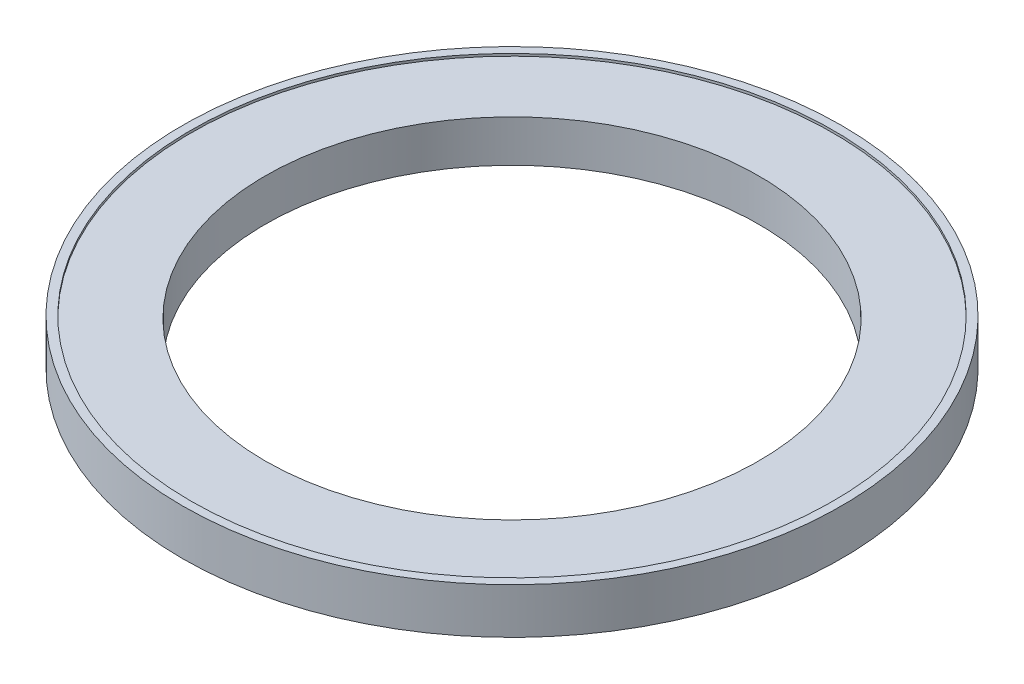
ISO-10303-21;
HEADER;
FILE_DESCRIPTION(('STEP AP214'),'2;1');
FILE_NAME('part.step','',(''),(''),'','','');
FILE_SCHEMA(('AUTOMOTIVE_DESIGN { 1 0 10303 214 1 1 1 1 }'));
ENDSEC;
DATA;
#1=APPLICATION_CONTEXT('core data for automotive mechanical design processes');
#2=APPLICATION_PROTOCOL_DEFINITION('international standard','automotive_design',2000,#1);
#3=PRODUCT_CONTEXT('',#1,'mechanical');
#4=PRODUCT('Part','Part','',(#3));
#5=PRODUCT_RELATED_PRODUCT_CATEGORY('part','',(#4));
#6=PRODUCT_DEFINITION_FORMATION('','',#4);
#7=PRODUCT_DEFINITION_CONTEXT('part definition',#1,'design');
#8=PRODUCT_DEFINITION('design','',#6,#7);
#9=PRODUCT_DEFINITION_SHAPE('','',#8);
#10=(LENGTH_UNIT() NAMED_UNIT(*) SI_UNIT(.MILLI.,.METRE.));
#11=(NAMED_UNIT(*) PLANE_ANGLE_UNIT() SI_UNIT($,.RADIAN.));
#12=(NAMED_UNIT(*) SI_UNIT($,.STERADIAN.) SOLID_ANGLE_UNIT());
#13=UNCERTAINTY_MEASURE_WITH_UNIT(LENGTH_MEASURE(1.E-05),#10,'distance_accuracy_value','');
#14=(GEOMETRIC_REPRESENTATION_CONTEXT(3) GLOBAL_UNCERTAINTY_ASSIGNED_CONTEXT((#13)) GLOBAL_UNIT_ASSIGNED_CONTEXT((#10,
#11,#12)) REPRESENTATION_CONTEXT('',''));
#15=CARTESIAN_POINT('',(0.,0.,0.));
#16=DIRECTION('',(0.,0.,1.));
#17=DIRECTION('',(1.,0.,0.));
#18=AXIS2_PLACEMENT_3D('',#15,#16,#17);
#19=CARTESIAN_POINT('',(0.,-3.81040868112797,0.));
#20=DIRECTION('',(0.,1.,0.));
#21=DIRECTION('',(0.,0.,1.));
#22=AXIS2_PLACEMENT_3D('',#19,#20,#21);
#23=CONICAL_SURFACE('',#22,27.4999999999997,1.3089969389955);
#24=CARTESIAN_POINT('',(0.,-3.810408681129,0.));
#25=DIRECTION('',(0.,1.,0.));
#26=DIRECTION('',(0.,0.,1.));
#27=AXIS2_PLACEMENT_3D('',#24,#25,#26);
#28=CIRCLE('',#27,27.5);
#29=CARTESIAN_POINT('',(0.,-3.810408681129,27.5));
#30=VERTEX_POINT('',#29);
#31=EDGE_CURVE('E30',#30,#30,#28,.T.);
#32=ORIENTED_EDGE('',*,*,#31,.F.);
#33=EDGE_LOOP('',(#32));
#34=FACE_BOUND('',#33,.T.);
#35=CARTESIAN_POINT('',(0.,-4.7000000000001,0.));
#36=DIRECTION('',(0.,1.,0.));
#37=DIRECTION('',(0.,0.,1.));
#38=AXIS2_PLACEMENT_3D('',#35,#36,#37);
#39=CIRCLE('',#38,24.18);
#40=CARTESIAN_POINT('',(0.,-4.7000000000001,24.18));
#41=VERTEX_POINT('',#40);
#42=EDGE_CURVE('E18',#41,#41,#39,.T.);
#43=ORIENTED_EDGE('',*,*,#42,.T.);
#44=EDGE_LOOP('',(#43));
#45=FACE_BOUND('',#44,.T.);
#46=ADVANCED_FACE('F15',(#34,#45),#23,.T.);
#47=CARTESIAN_POINT('',(0.,-4.7,0.));
#48=DIRECTION('',(0.,1.,0.));
#49=DIRECTION('',(0.,0.,1.));
#50=AXIS2_PLACEMENT_3D('',#47,#48,#49);
#51=PLANE('',#50);
#52=CARTESIAN_POINT('',(0.,-4.7,0.));
#53=DIRECTION('',(0.,1.,0.));
#54=DIRECTION('',(0.,0.,1.));
#55=AXIS2_PLACEMENT_3D('',#52,#53,#54);
#56=CIRCLE('',#55,22.5);
#57=CARTESIAN_POINT('',(0.,-4.7,22.5));
#58=VERTEX_POINT('',#57);
#59=EDGE_CURVE('E42',#58,#58,#56,.T.);
#60=ORIENTED_EDGE('',*,*,#59,.T.);
#61=EDGE_LOOP('',(#60));
#62=FACE_BOUND('',#61,.T.);
#63=ORIENTED_EDGE('',*,*,#42,.F.);
#64=EDGE_LOOP('',(#63));
#65=FACE_BOUND('',#64,.T.);
#66=ADVANCED_FACE('F53',(#62,#65),#51,.F.);
#67=CARTESIAN_POINT('',(0.,0.,0.));
#68=DIRECTION('',(0.,1.,0.));
#69=DIRECTION('',(0.,0.,1.));
#70=AXIS2_PLACEMENT_3D('',#67,#68,#69);
#71=CYLINDRICAL_SURFACE('',#70,27.5);
#72=CARTESIAN_POINT('',(0.,0.,0.));
#73=DIRECTION('',(0.,1.,0.));
#74=DIRECTION('',(0.,0.,1.));
#75=AXIS2_PLACEMENT_3D('',#72,#73,#74);
#76=CIRCLE('',#75,27.5);
#77=CARTESIAN_POINT('',(0.,0.,27.5));
#78=VERTEX_POINT('',#77);
#79=EDGE_CURVE('E40',#78,#78,#76,.T.);
#80=ORIENTED_EDGE('',*,*,#79,.F.);
#81=EDGE_LOOP('',(#80));
#82=FACE_BOUND('',#81,.T.);
#83=ORIENTED_EDGE('',*,*,#31,.T.);
#84=EDGE_LOOP('',(#83));
#85=FACE_BOUND('',#84,.T.);
#86=ADVANCED_FACE('F55',(#82,#85),#71,.T.);
#87=CARTESIAN_POINT('',(0.,0.,0.));
#88=DIRECTION('',(0.,1.,0.));
#89=DIRECTION('',(0.,0.,1.));
#90=AXIS2_PLACEMENT_3D('',#87,#88,#89);
#91=CYLINDRICAL_SURFACE('',#90,22.5);
#92=ORIENTED_EDGE('',*,*,#59,.F.);
#93=EDGE_LOOP('',(#92));
#94=FACE_BOUND('',#93,.T.);
#95=CARTESIAN_POINT('',(0.,-3.7,0.));
#96=DIRECTION('',(0.,1.,0.));
#97=DIRECTION('',(0.,0.,1.));
#98=AXIS2_PLACEMENT_3D('',#95,#96,#97);
#99=CIRCLE('',#98,22.5);
#100=CARTESIAN_POINT('',(0.,-3.7,22.5));
#101=VERTEX_POINT('',#100);
#102=EDGE_CURVE('E37',#101,#101,#99,.T.);
#103=ORIENTED_EDGE('',*,*,#102,.T.);
#104=EDGE_LOOP('',(#103));
#105=FACE_BOUND('',#104,.T.);
#106=ADVANCED_FACE('F61',(#94,#105),#91,.F.);
#107=CARTESIAN_POINT('',(0.,0.,0.));
#108=DIRECTION('',(0.,1.,0.));
#109=DIRECTION('',(0.,0.,1.));
#110=AXIS2_PLACEMENT_3D('',#107,#108,#109);
#111=PLANE('',#110);
#112=CARTESIAN_POINT('',(0.,0.,0.));
#113=DIRECTION('',(0.,1.,0.));
#114=DIRECTION('',(0.,0.,1.));
#115=AXIS2_PLACEMENT_3D('',#112,#113,#114);
#116=CIRCLE('',#115,26.8);
#117=CARTESIAN_POINT('',(0.,0.,26.8));
#118=VERTEX_POINT('',#117);
#119=EDGE_CURVE('E34',#118,#118,#116,.F.);
#120=ORIENTED_EDGE('',*,*,#119,.T.);
#121=EDGE_LOOP('',(#120));
#122=FACE_BOUND('',#121,.T.);
#123=ORIENTED_EDGE('',*,*,#79,.T.);
#124=EDGE_LOOP('',(#123));
#125=FACE_BOUND('',#124,.T.);
#126=ADVANCED_FACE('F83',(#122,#125),#111,.T.);
#127=CARTESIAN_POINT('',(0.,-3.7,0.));
#128=DIRECTION('',(0.,1.,0.));
#129=DIRECTION('',(0.,0.,1.));
#130=AXIS2_PLACEMENT_3D('',#127,#128,#129);
#131=PLANE('',#130);
#132=CARTESIAN_POINT('',(0.,-3.7,0.));
#133=DIRECTION('',(0.,1.,0.));
#134=DIRECTION('',(0.,0.,1.));
#135=AXIS2_PLACEMENT_3D('',#132,#133,#134);
#136=CIRCLE('',#135,20.6);
#137=CARTESIAN_POINT('',(0.,-3.7,20.6));
#138=VERTEX_POINT('',#137);
#139=EDGE_CURVE('E27',#138,#138,#136,.T.);
#140=ORIENTED_EDGE('',*,*,#139,.T.);
#141=EDGE_LOOP('',(#140));
#142=FACE_BOUND('',#141,.T.);
#143=ORIENTED_EDGE('',*,*,#102,.F.);
#144=EDGE_LOOP('',(#143));
#145=FACE_BOUND('',#144,.T.);
#146=ADVANCED_FACE('F79',(#142,#145),#131,.F.);
#147=CARTESIAN_POINT('',(0.,0.,0.));
#148=DIRECTION('',(0.,1.,0.));
#149=DIRECTION('',(0.,0.,1.));
#150=AXIS2_PLACEMENT_3D('',#147,#148,#149);
#151=CYLINDRICAL_SURFACE('',#150,26.8);
#152=CARTESIAN_POINT('',(0.,-0.2,0.));
#153=DIRECTION('',(0.,1.,0.));
#154=DIRECTION('',(0.,0.,1.));
#155=AXIS2_PLACEMENT_3D('',#152,#153,#154);
#156=CIRCLE('',#155,26.8);
#157=CARTESIAN_POINT('',(0.,-0.2,26.8));
#158=VERTEX_POINT('',#157);
#159=EDGE_CURVE('E22',#158,#158,#156,.T.);
#160=ORIENTED_EDGE('',*,*,#159,.F.);
#161=EDGE_LOOP('',(#160));
#162=FACE_BOUND('',#161,.T.);
#163=ORIENTED_EDGE('',*,*,#119,.F.);
#164=EDGE_LOOP('',(#163));
#165=FACE_BOUND('',#164,.T.);
#166=ADVANCED_FACE('F72',(#162,#165),#151,.F.);
#167=CARTESIAN_POINT('',(0.,0.,0.));
#168=DIRECTION('',(0.,1.,0.));
#169=DIRECTION('',(0.,0.,1.));
#170=AXIS2_PLACEMENT_3D('',#167,#168,#169);
#171=CYLINDRICAL_SURFACE('',#170,20.6);
#172=CARTESIAN_POINT('',(0.,-0.2,0.));
#173=DIRECTION('',(0.,1.,0.));
#174=DIRECTION('',(0.,0.,1.));
#175=AXIS2_PLACEMENT_3D('',#172,#173,#174);
#176=CIRCLE('',#175,20.6);
#177=CARTESIAN_POINT('',(0.,-0.2,20.6));
#178=VERTEX_POINT('',#177);
#179=EDGE_CURVE('E10',#178,#178,#176,.F.);
#180=ORIENTED_EDGE('',*,*,#179,.F.);
#181=EDGE_LOOP('',(#180));
#182=FACE_BOUND('',#181,.T.);
#183=ORIENTED_EDGE('',*,*,#139,.F.);
#184=EDGE_LOOP('',(#183));
#185=FACE_BOUND('',#184,.T.);
#186=ADVANCED_FACE('F67',(#182,#185),#171,.F.);
#187=CARTESIAN_POINT('',(0.,-0.2,0.));
#188=DIRECTION('',(0.,1.,0.));
#189=DIRECTION('',(0.,0.,1.));
#190=AXIS2_PLACEMENT_3D('',#187,#188,#189);
#191=PLANE('',#190);
#192=ORIENTED_EDGE('',*,*,#179,.T.);
#193=EDGE_LOOP('',(#192));
#194=FACE_BOUND('',#193,.T.);
#195=ORIENTED_EDGE('',*,*,#159,.T.);
#196=EDGE_LOOP('',(#195));
#197=FACE_BOUND('',#196,.T.);
#198=ADVANCED_FACE('F65',(#194,#197),#191,.T.);
#199=CLOSED_SHELL('',(#46,#66,#86,#106,#126,#146,#166,#186,#198));
#200=MANIFOLD_SOLID_BREP('B1',#199);
#201=ADVANCED_BREP_SHAPE_REPRESENTATION('',(#18,#200),#14);
#202=SHAPE_DEFINITION_REPRESENTATION(#9,#201);
ENDSEC;
END-ISO-10303-21;
